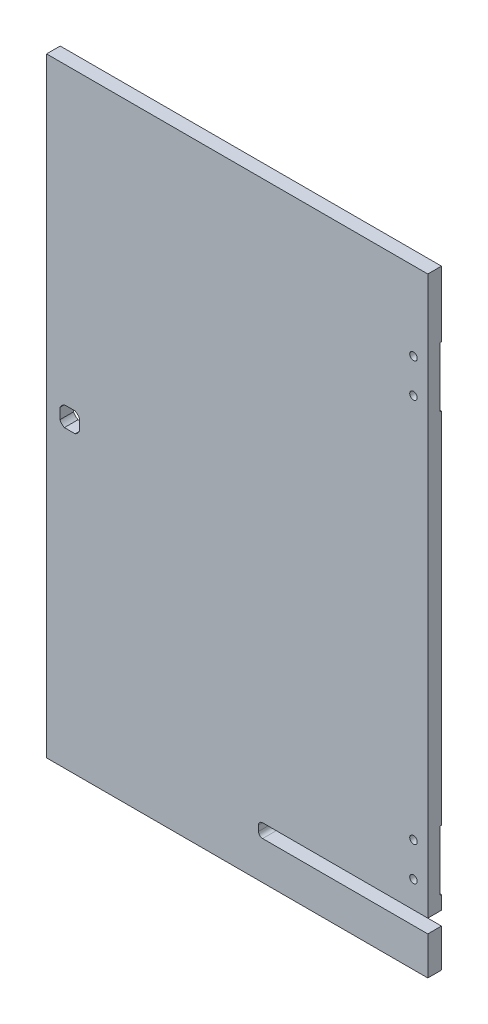
ISO-10303-21;
HEADER;
FILE_DESCRIPTION(('STEP AP214'),'2;1');
FILE_NAME('part.step','',(''),(''),'','','');
FILE_SCHEMA(('AUTOMOTIVE_DESIGN { 1 0 10303 214 1 1 1 1 }'));
ENDSEC;
DATA;
#1=APPLICATION_CONTEXT('core data for automotive mechanical design processes');
#2=APPLICATION_PROTOCOL_DEFINITION('international standard','automotive_design',2000,#1);
#3=PRODUCT_CONTEXT('',#1,'mechanical');
#4=PRODUCT('Part','Part','',(#3));
#5=PRODUCT_RELATED_PRODUCT_CATEGORY('part','',(#4));
#6=PRODUCT_DEFINITION_FORMATION('','',#4);
#7=PRODUCT_DEFINITION_CONTEXT('part definition',#1,'design');
#8=PRODUCT_DEFINITION('design','',#6,#7);
#9=PRODUCT_DEFINITION_SHAPE('','',#8);
#10=(LENGTH_UNIT() NAMED_UNIT(*) SI_UNIT(.MILLI.,.METRE.));
#11=(NAMED_UNIT(*) PLANE_ANGLE_UNIT() SI_UNIT($,.RADIAN.));
#12=(NAMED_UNIT(*) SI_UNIT($,.STERADIAN.) SOLID_ANGLE_UNIT());
#13=UNCERTAINTY_MEASURE_WITH_UNIT(LENGTH_MEASURE(1.E-05),#10,'distance_accuracy_value','');
#14=(GEOMETRIC_REPRESENTATION_CONTEXT(3) GLOBAL_UNCERTAINTY_ASSIGNED_CONTEXT((#13)) GLOBAL_UNIT_ASSIGNED_CONTEXT((#10,
#11,#12)) REPRESENTATION_CONTEXT('',''));
#15=CARTESIAN_POINT('',(0.,0.,0.));
#16=DIRECTION('',(0.,0.,1.));
#17=DIRECTION('',(1.,0.,0.));
#18=AXIS2_PLACEMENT_3D('',#15,#16,#17);
#19=CARTESIAN_POINT('',(0.,0.,10.));
#20=DIRECTION('',(0.,0.,1.));
#21=DIRECTION('',(1.,0.,0.));
#22=AXIS2_PLACEMENT_3D('',#19,#20,#21);
#23=PLANE('',#22);
#24=DIRECTION('',(1.,0.,0.));
#25=VECTOR('',#24,1.);
#26=CARTESIAN_POINT('',(140.749999999999,-185.5,10.));
#27=LINE('',#26,#25);
#28=CARTESIAN_POINT('',(18.6472087545796,-185.5,10.));
#29=VERTEX_POINT('',#28);
#30=CARTESIAN_POINT('',(139.75,-185.5,10.));
#31=VERTEX_POINT('',#30);
#32=EDGE_CURVE('E299',#29,#31,#27,.T.);
#33=ORIENTED_EDGE('',*,*,#32,.T.);
#34=DIRECTION('',(0.,1.,0.));
#35=VECTOR('',#34,1.);
#36=CARTESIAN_POINT('',(139.75,223.5,10.));
#37=LINE('',#36,#35);
#38=CARTESIAN_POINT('',(139.75,223.5,10.));
#39=VERTEX_POINT('',#38);
#40=EDGE_CURVE('E446',#31,#39,#37,.T.);
#41=ORIENTED_EDGE('',*,*,#40,.T.);
#42=DIRECTION('',(-1.,0.,0.));
#43=VECTOR('',#42,1.);
#44=CARTESIAN_POINT('',(-139.75,223.5,10.));
#45=LINE('',#44,#43);
#46=CARTESIAN_POINT('',(-139.75,223.5,10.));
#47=VERTEX_POINT('',#46);
#48=EDGE_CURVE('E445',#39,#47,#45,.T.);
#49=ORIENTED_EDGE('',*,*,#48,.T.);
#50=DIRECTION('',(0.,-1.,0.));
#51=VECTOR('',#50,1.);
#52=CARTESIAN_POINT('',(-139.75,223.5,10.));
#53=LINE('',#52,#51);
#54=CARTESIAN_POINT('',(-139.75,-223.5,10.));
#55=VERTEX_POINT('',#54);
#56=EDGE_CURVE('E448',#47,#55,#53,.T.);
#57=ORIENTED_EDGE('',*,*,#56,.T.);
#58=DIRECTION('',(1.,0.,0.));
#59=VECTOR('',#58,1.);
#60=CARTESIAN_POINT('',(-139.75,-223.5,10.));
#61=LINE('',#60,#59);
#62=CARTESIAN_POINT('',(139.75,-223.5,10.));
#63=VERTEX_POINT('',#62);
#64=EDGE_CURVE('E450',#55,#63,#61,.T.);
#65=ORIENTED_EDGE('',*,*,#64,.T.);
#66=CARTESIAN_POINT('',(139.75,-195.5,10.));
#67=VERTEX_POINT('',#66);
#68=EDGE_CURVE('E442',#63,#67,#37,.T.);
#69=ORIENTED_EDGE('',*,*,#68,.T.);
#70=DIRECTION('',(-1.,0.,0.));
#71=VECTOR('',#70,1.);
#72=CARTESIAN_POINT('',(140.749999999999,-195.5,10.));
#73=LINE('',#72,#71);
#74=CARTESIAN_POINT('',(18.6472087545796,-195.5,10.));
#75=VERTEX_POINT('',#74);
#76=EDGE_CURVE('E286',#67,#75,#73,.T.);
#77=ORIENTED_EDGE('',*,*,#76,.T.);
#78=CARTESIAN_POINT('',(18.6472087545795,-192.5,10.));
#79=DIRECTION('',(0.,0.,-1.));
#80=DIRECTION('',(-1.,0.,0.));
#81=AXIS2_PLACEMENT_3D('',#78,#79,#80);
#82=CIRCLE('',#81,3.);
#83=CARTESIAN_POINT('',(15.6472087545795,-192.5,10.));
#84=VERTEX_POINT('',#83);
#85=EDGE_CURVE('E289',#75,#84,#82,.T.);
#86=ORIENTED_EDGE('',*,*,#85,.T.);
#87=DIRECTION('',(0.,1.,0.));
#88=VECTOR('',#87,1.);
#89=CARTESIAN_POINT('',(15.6472087545795,-188.5,10.));
#90=LINE('',#89,#88);
#91=CARTESIAN_POINT('',(15.6472087545795,-188.5,10.));
#92=VERTEX_POINT('',#91);
#93=EDGE_CURVE('E293',#84,#92,#90,.T.);
#94=ORIENTED_EDGE('',*,*,#93,.T.);
#95=CARTESIAN_POINT('',(18.6472087545795,-188.5,10.));
#96=DIRECTION('',(0.,0.,-1.));
#97=DIRECTION('',(1.,0.,0.));
#98=AXIS2_PLACEMENT_3D('',#95,#96,#97);
#99=CIRCLE('',#98,3.);
#100=EDGE_CURVE('E296',#92,#29,#99,.T.);
#101=ORIENTED_EDGE('',*,*,#100,.T.);
#102=EDGE_LOOP('',(#33,#41,#49,#57,#65,#69,#77,#86,#94,#101));
#103=FACE_BOUND('',#102,.T.);
#104=CARTESIAN_POINT('',(129.249999999999,165.999999999999,10.));
#105=DIRECTION('',(0.,0.,-1.));
#106=DIRECTION('',(-1.,0.,0.));
#107=AXIS2_PLACEMENT_3D('',#104,#105,#106);
#108=CIRCLE('',#107,2.75000000000001);
#109=CARTESIAN_POINT('',(126.499999999999,165.999999999999,10.));
#110=VERTEX_POINT('',#109);
#111=EDGE_CURVE('E327',#110,#110,#108,.T.);
#112=ORIENTED_EDGE('',*,*,#111,.T.);
#113=EDGE_LOOP('',(#112));
#114=FACE_BOUND('',#113,.T.);
#115=CARTESIAN_POINT('',(129.249999999999,140.999999999999,10.));
#116=DIRECTION('',(0.,0.,-1.));
#117=DIRECTION('',(-1.,0.,0.));
#118=AXIS2_PLACEMENT_3D('',#115,#116,#117);
#119=CIRCLE('',#118,2.75000000000001);
#120=CARTESIAN_POINT('',(126.499999999999,140.999999999999,10.));
#121=VERTEX_POINT('',#120);
#122=EDGE_CURVE('E334',#121,#121,#119,.T.);
#123=ORIENTED_EDGE('',*,*,#122,.T.);
#124=EDGE_LOOP('',(#123));
#125=FACE_BOUND('',#124,.T.);
#126=CARTESIAN_POINT('',(129.249999999999,-141.000000000001,10.));
#127=DIRECTION('',(0.,0.,-1.));
#128=DIRECTION('',(-1.,0.,0.));
#129=AXIS2_PLACEMENT_3D('',#126,#127,#128);
#130=CIRCLE('',#129,2.75000000000001);
#131=CARTESIAN_POINT('',(126.499999999999,-141.000000000001,10.));
#132=VERTEX_POINT('',#131);
#133=EDGE_CURVE('E340',#132,#132,#130,.T.);
#134=ORIENTED_EDGE('',*,*,#133,.T.);
#135=EDGE_LOOP('',(#134));
#136=FACE_BOUND('',#135,.T.);
#137=CARTESIAN_POINT('',(129.249999999999,-166.000000000001,10.));
#138=DIRECTION('',(0.,0.,-1.));
#139=DIRECTION('',(-1.,0.,0.));
#140=AXIS2_PLACEMENT_3D('',#137,#138,#139);
#141=CIRCLE('',#140,2.75000000000001);
#142=CARTESIAN_POINT('',(126.499999999999,-166.000000000001,10.));
#143=VERTEX_POINT('',#142);
#144=EDGE_CURVE('E346',#143,#143,#141,.T.);
#145=ORIENTED_EDGE('',*,*,#144,.T.);
#146=EDGE_LOOP('',(#145));
#147=FACE_BOUND('',#146,.T.);
#148=CARTESIAN_POINT('',(-122.750000000001,0.,10.));
#149=DIRECTION('',(0.,0.,1.));
#150=DIRECTION('',(1.,0.,0.));
#151=AXIS2_PLACEMENT_3D('',#148,#149,#150);
#152=CIRCLE('',#151,8.25);
#153=CARTESIAN_POINT('',(-115.500000000001,3.93700393700592,10.));
#154=VERTEX_POINT('',#153);
#155=CARTESIAN_POINT('',(-118.812996062995,7.25000000000004,10.));
#156=VERTEX_POINT('',#155);
#157=EDGE_CURVE('E253',#154,#156,#152,.T.);
#158=ORIENTED_EDGE('',*,*,#157,.F.);
#159=DIRECTION('',(0.,-1.,0.));
#160=VECTOR('',#159,1.);
#161=CARTESIAN_POINT('',(-115.500000000001,0.,10.));
#162=LINE('',#161,#160);
#163=CARTESIAN_POINT('',(-115.500000000001,-3.93700393700586,10.));
#164=VERTEX_POINT('',#163);
#165=EDGE_CURVE('E47',#154,#164,#162,.T.);
#166=ORIENTED_EDGE('',*,*,#165,.T.);
#167=CARTESIAN_POINT('',(-118.812996062995,-7.24999999999996,10.));
#168=VERTEX_POINT('',#167);
#169=EDGE_CURVE('E247',#168,#164,#152,.T.);
#170=ORIENTED_EDGE('',*,*,#169,.F.);
#171=DIRECTION('',(1.,0.,0.));
#172=VECTOR('',#171,1.);
#173=CARTESIAN_POINT('',(0.,-7.24999999999996,10.));
#174=LINE('',#173,#172);
#175=CARTESIAN_POINT('',(-126.687003937007,-7.24999999999996,10.));
#176=VERTEX_POINT('',#175);
#177=EDGE_CURVE('E250',#176,#168,#174,.T.);
#178=ORIENTED_EDGE('',*,*,#177,.F.);
#179=CARTESIAN_POINT('',(-130.000000000001,-3.93700393700588,10.));
#180=VERTEX_POINT('',#179);
#181=EDGE_CURVE('E252',#180,#176,#152,.T.);
#182=ORIENTED_EDGE('',*,*,#181,.F.);
#183=DIRECTION('',(0.,-1.,0.));
#184=VECTOR('',#183,1.);
#185=CARTESIAN_POINT('',(-130.000000000001,0.,10.));
#186=LINE('',#185,#184);
#187=CARTESIAN_POINT('',(-130.000000000001,3.93700393700594,10.));
#188=VERTEX_POINT('',#187);
#189=EDGE_CURVE('E267',#188,#180,#186,.T.);
#190=ORIENTED_EDGE('',*,*,#189,.F.);
#191=CARTESIAN_POINT('',(-126.687003937007,7.25000000000004,10.));
#192=VERTEX_POINT('',#191);
#193=EDGE_CURVE('E264',#192,#188,#152,.T.);
#194=ORIENTED_EDGE('',*,*,#193,.F.);
#195=DIRECTION('',(1.,0.,0.));
#196=VECTOR('',#195,1.);
#197=CARTESIAN_POINT('',(0.,7.25000000000004,10.));
#198=LINE('',#197,#196);
#199=EDGE_CURVE('E263',#192,#156,#198,.T.);
#200=ORIENTED_EDGE('',*,*,#199,.T.);
#201=EDGE_LOOP('',(#158,#166,#170,#178,#182,#190,#194,#200));
#202=FACE_BOUND('',#201,.T.);
#203=ADVANCED_FACE('F32',(#103,#114,#125,#136,#147,#202),#23,.T.);
#204=CARTESIAN_POINT('',(0.,0.,0.));
#205=DIRECTION('',(0.,0.,1.));
#206=DIRECTION('',(1.,0.,0.));
#207=AXIS2_PLACEMENT_3D('',#204,#205,#206);
#208=PLANE('',#207);
#209=DIRECTION('',(0.,1.,0.));
#210=VECTOR('',#209,1.);
#211=CARTESIAN_POINT('',(139.75,223.5,0.));
#212=LINE('',#211,#210);
#213=CARTESIAN_POINT('',(139.75,-185.5,0.));
#214=VERTEX_POINT('',#213);
#215=CARTESIAN_POINT('',(139.75,-175.500000000001,0.));
#216=VERTEX_POINT('',#215);
#217=EDGE_CURVE('E457',#214,#216,#212,.T.);
#218=ORIENTED_EDGE('',*,*,#217,.F.);
#219=DIRECTION('',(1.,0.,0.));
#220=VECTOR('',#219,1.);
#221=CARTESIAN_POINT('',(140.749999999999,-185.5,0.));
#222=LINE('',#221,#220);
#223=CARTESIAN_POINT('',(18.6472087545796,-185.5,0.));
#224=VERTEX_POINT('',#223);
#225=EDGE_CURVE('E290',#224,#214,#222,.T.);
#226=ORIENTED_EDGE('',*,*,#225,.F.);
#227=CARTESIAN_POINT('',(18.6472087545795,-188.5,0.));
#228=DIRECTION('',(0.,0.,-1.));
#229=DIRECTION('',(1.,0.,0.));
#230=AXIS2_PLACEMENT_3D('',#227,#228,#229);
#231=CIRCLE('',#230,3.);
#232=CARTESIAN_POINT('',(15.6472087545795,-188.5,0.));
#233=VERTEX_POINT('',#232);
#234=EDGE_CURVE('E308',#233,#224,#231,.T.);
#235=ORIENTED_EDGE('',*,*,#234,.F.);
#236=DIRECTION('',(0.,1.,0.));
#237=VECTOR('',#236,1.);
#238=CARTESIAN_POINT('',(15.6472087545795,-188.5,0.));
#239=LINE('',#238,#237);
#240=CARTESIAN_POINT('',(15.6472087545795,-192.5,0.));
#241=VERTEX_POINT('',#240);
#242=EDGE_CURVE('E305',#241,#233,#239,.T.);
#243=ORIENTED_EDGE('',*,*,#242,.F.);
#244=CARTESIAN_POINT('',(18.6472087545795,-192.5,0.));
#245=DIRECTION('',(0.,0.,-1.));
#246=DIRECTION('',(-1.,0.,0.));
#247=AXIS2_PLACEMENT_3D('',#244,#245,#246);
#248=CIRCLE('',#247,3.);
#249=CARTESIAN_POINT('',(18.6472087545796,-195.5,0.));
#250=VERTEX_POINT('',#249);
#251=EDGE_CURVE('E274',#250,#241,#248,.T.);
#252=ORIENTED_EDGE('',*,*,#251,.F.);
#253=DIRECTION('',(1.,0.,0.));
#254=VECTOR('',#253,1.);
#255=CARTESIAN_POINT('',(0.,-195.5,0.));
#256=LINE('',#255,#254);
#257=CARTESIAN_POINT('',(139.75,-195.5,0.));
#258=VERTEX_POINT('',#257);
#259=EDGE_CURVE('E11',#250,#258,#256,.T.);
#260=ORIENTED_EDGE('',*,*,#259,.T.);
#261=CARTESIAN_POINT('',(139.75,-223.5,0.));
#262=VERTEX_POINT('',#261);
#263=EDGE_CURVE('E453',#262,#258,#212,.T.);
#264=ORIENTED_EDGE('',*,*,#263,.F.);
#265=DIRECTION('',(1.,0.,0.));
#266=VECTOR('',#265,1.);
#267=CARTESIAN_POINT('',(-139.75,-223.5,0.));
#268=LINE('',#267,#266);
#269=CARTESIAN_POINT('',(-139.75,-223.5,0.));
#270=VERTEX_POINT('',#269);
#271=EDGE_CURVE('E462',#270,#262,#268,.T.);
#272=ORIENTED_EDGE('',*,*,#271,.F.);
#273=DIRECTION('',(0.,-1.,0.));
#274=VECTOR('',#273,1.);
#275=CARTESIAN_POINT('',(-139.75,223.5,0.));
#276=LINE('',#275,#274);
#277=CARTESIAN_POINT('',(-139.75,223.5,0.));
#278=VERTEX_POINT('',#277);
#279=EDGE_CURVE('E460',#278,#270,#276,.T.);
#280=ORIENTED_EDGE('',*,*,#279,.F.);
#281=DIRECTION('',(-1.,0.,0.));
#282=VECTOR('',#281,1.);
#283=CARTESIAN_POINT('',(-139.75,223.5,0.));
#284=LINE('',#283,#282);
#285=CARTESIAN_POINT('',(139.75,223.5,0.));
#286=VERTEX_POINT('',#285);
#287=EDGE_CURVE('E456',#286,#278,#284,.T.);
#288=ORIENTED_EDGE('',*,*,#287,.F.);
#289=CARTESIAN_POINT('',(139.75,175.499999999999,0.));
#290=VERTEX_POINT('',#289);
#291=EDGE_CURVE('E388',#290,#286,#212,.T.);
#292=ORIENTED_EDGE('',*,*,#291,.F.);
#293=DIRECTION('',(1.,0.,0.));
#294=VECTOR('',#293,1.);
#295=CARTESIAN_POINT('',(139.75,175.499999999999,0.));
#296=LINE('',#295,#294);
#297=CARTESIAN_POINT('',(121.749999999999,175.499999999999,0.));
#298=VERTEX_POINT('',#297);
#299=EDGE_CURVE('E355',#298,#290,#296,.T.);
#300=ORIENTED_EDGE('',*,*,#299,.F.);
#301=CARTESIAN_POINT('',(121.749999999999,172.499999999999,0.));
#302=DIRECTION('',(0.,0.,-1.));
#303=DIRECTION('',(1.,0.,0.));
#304=AXIS2_PLACEMENT_3D('',#301,#302,#303);
#305=CIRCLE('',#304,3.);
#306=CARTESIAN_POINT('',(118.749999999999,172.499999999999,0.));
#307=VERTEX_POINT('',#306);
#308=EDGE_CURVE('E381',#307,#298,#305,.T.);
#309=ORIENTED_EDGE('',*,*,#308,.F.);
#310=DIRECTION('',(0.,1.,0.));
#311=VECTOR('',#310,1.);
#312=CARTESIAN_POINT('',(118.749999999999,172.499999999999,0.));
#313=LINE('',#312,#311);
#314=CARTESIAN_POINT('',(118.749999999999,134.499999999999,0.));
#315=VERTEX_POINT('',#314);
#316=EDGE_CURVE('E378',#315,#307,#313,.T.);
#317=ORIENTED_EDGE('',*,*,#316,.F.);
#318=CARTESIAN_POINT('',(121.749999999999,134.499999999999,0.));
#319=DIRECTION('',(0.,0.,-1.));
#320=DIRECTION('',(-1.,0.,0.));
#321=AXIS2_PLACEMENT_3D('',#318,#319,#320);
#322=CIRCLE('',#321,3.);
#323=CARTESIAN_POINT('',(121.749999999999,131.499999999999,0.));
#324=VERTEX_POINT('',#323);
#325=EDGE_CURVE('E374',#324,#315,#322,.T.);
#326=ORIENTED_EDGE('',*,*,#325,.F.);
#327=DIRECTION('',(-1.,0.,0.));
#328=VECTOR('',#327,1.);
#329=CARTESIAN_POINT('',(139.75,131.499999999999,0.));
#330=LINE('',#329,#328);
#331=CARTESIAN_POINT('',(139.75,131.499999999999,0.));
#332=VERTEX_POINT('',#331);
#333=EDGE_CURVE('E371',#332,#324,#330,.T.);
#334=ORIENTED_EDGE('',*,*,#333,.F.);
#335=CARTESIAN_POINT('',(139.75,-131.500000000001,0.));
#336=VERTEX_POINT('',#335);
#337=EDGE_CURVE('E458',#336,#332,#212,.T.);
#338=ORIENTED_EDGE('',*,*,#337,.F.);
#339=DIRECTION('',(1.,0.,0.));
#340=VECTOR('',#339,1.);
#341=CARTESIAN_POINT('',(139.75,-131.500000000001,0.));
#342=LINE('',#341,#340);
#343=CARTESIAN_POINT('',(121.749999999999,-131.500000000001,0.));
#344=VERTEX_POINT('',#343);
#345=EDGE_CURVE('E402',#344,#336,#342,.T.);
#346=ORIENTED_EDGE('',*,*,#345,.F.);
#347=CARTESIAN_POINT('',(121.749999999999,-134.500000000001,0.));
#348=DIRECTION('',(0.,0.,-1.));
#349=DIRECTION('',(1.,0.,0.));
#350=AXIS2_PLACEMENT_3D('',#347,#348,#349);
#351=CIRCLE('',#350,3.);
#352=CARTESIAN_POINT('',(118.749999999999,-134.500000000001,0.));
#353=VERTEX_POINT('',#352);
#354=EDGE_CURVE('E426',#353,#344,#351,.T.);
#355=ORIENTED_EDGE('',*,*,#354,.F.);
#356=DIRECTION('',(0.,1.,0.));
#357=VECTOR('',#356,1.);
#358=CARTESIAN_POINT('',(118.749999999999,-134.500000000001,0.));
#359=LINE('',#358,#357);
#360=CARTESIAN_POINT('',(118.749999999999,-172.500000000001,0.));
#361=VERTEX_POINT('',#360);
#362=EDGE_CURVE('E423',#361,#353,#359,.T.);
#363=ORIENTED_EDGE('',*,*,#362,.F.);
#364=CARTESIAN_POINT('',(121.749999999999,-172.500000000001,0.));
#365=DIRECTION('',(0.,0.,-1.));
#366=DIRECTION('',(-1.,0.,0.));
#367=AXIS2_PLACEMENT_3D('',#364,#365,#366);
#368=CIRCLE('',#367,3.);
#369=CARTESIAN_POINT('',(121.749999999999,-175.500000000001,0.));
#370=VERTEX_POINT('',#369);
#371=EDGE_CURVE('E420',#370,#361,#368,.T.);
#372=ORIENTED_EDGE('',*,*,#371,.F.);
#373=DIRECTION('',(-1.,0.,0.));
#374=VECTOR('',#373,1.);
#375=CARTESIAN_POINT('',(139.75,-175.500000000001,0.));
#376=LINE('',#375,#374);
#377=EDGE_CURVE('E330',#216,#370,#376,.T.);
#378=ORIENTED_EDGE('',*,*,#377,.F.);
#379=EDGE_LOOP('',(#218,#226,#235,#243,#252,#260,#264,#272,#280,#288,#292,#300,#309,#317,#326,
#334,#338,#346,#355,#363,#372,#378));
#380=FACE_BOUND('',#379,.T.);
#381=DIRECTION('',(0.,-1.,0.));
#382=VECTOR('',#381,1.);
#383=CARTESIAN_POINT('',(-115.500000000001,0.,0.));
#384=LINE('',#383,#382);
#385=CARTESIAN_POINT('',(-115.500000000001,3.93700393700592,0.));
#386=VERTEX_POINT('',#385);
#387=CARTESIAN_POINT('',(-115.500000000001,-3.93700393700586,0.));
#388=VERTEX_POINT('',#387);
#389=EDGE_CURVE('E230',#386,#388,#384,.T.);
#390=ORIENTED_EDGE('',*,*,#389,.F.);
#391=CARTESIAN_POINT('',(-122.750000000001,0.,0.));
#392=DIRECTION('',(0.,0.,1.));
#393=DIRECTION('',(1.,0.,0.));
#394=AXIS2_PLACEMENT_3D('',#391,#392,#393);
#395=CIRCLE('',#394,8.25);
#396=CARTESIAN_POINT('',(-118.812996062995,7.25000000000003,0.));
#397=VERTEX_POINT('',#396);
#398=EDGE_CURVE('E236',#386,#397,#395,.T.);
#399=ORIENTED_EDGE('',*,*,#398,.T.);
#400=DIRECTION('',(1.,0.,0.));
#401=VECTOR('',#400,1.);
#402=CARTESIAN_POINT('',(0.,7.25000000000004,0.));
#403=LINE('',#402,#401);
#404=CARTESIAN_POINT('',(-126.687003937007,7.25000000000004,0.));
#405=VERTEX_POINT('',#404);
#406=EDGE_CURVE('E240',#405,#397,#403,.T.);
#407=ORIENTED_EDGE('',*,*,#406,.F.);
#408=CARTESIAN_POINT('',(-130.000000000001,3.93700393700594,0.));
#409=VERTEX_POINT('',#408);
#410=EDGE_CURVE('E242',#405,#409,#395,.T.);
#411=ORIENTED_EDGE('',*,*,#410,.T.);
#412=DIRECTION('',(0.,-1.,0.));
#413=VECTOR('',#412,1.);
#414=CARTESIAN_POINT('',(-130.000000000001,0.,0.));
#415=LINE('',#414,#413);
#416=CARTESIAN_POINT('',(-130.000000000001,-3.93700393700588,0.));
#417=VERTEX_POINT('',#416);
#418=EDGE_CURVE('E256',#409,#417,#415,.T.);
#419=ORIENTED_EDGE('',*,*,#418,.T.);
#420=CARTESIAN_POINT('',(-126.687003937007,-7.24999999999996,0.));
#421=VERTEX_POINT('',#420);
#422=EDGE_CURVE('E259',#417,#421,#395,.T.);
#423=ORIENTED_EDGE('',*,*,#422,.T.);
#424=DIRECTION('',(1.,0.,0.));
#425=VECTOR('',#424,1.);
#426=CARTESIAN_POINT('',(0.,-7.24999999999996,0.));
#427=LINE('',#426,#425);
#428=CARTESIAN_POINT('',(-118.812996062995,-7.24999999999996,0.));
#429=VERTEX_POINT('',#428);
#430=EDGE_CURVE('E260',#421,#429,#427,.T.);
#431=ORIENTED_EDGE('',*,*,#430,.T.);
#432=EDGE_CURVE('E233',#429,#388,#395,.T.);
#433=ORIENTED_EDGE('',*,*,#432,.T.);
#434=EDGE_LOOP('',(#390,#399,#407,#411,#419,#423,#431,#433));
#435=FACE_BOUND('',#434,.T.);
#436=ADVANCED_FACE('F244',(#380,#435),#208,.F.);
#437=CARTESIAN_POINT('',(139.75,223.5,10.));
#438=DIRECTION('',(-1.,0.,0.));
#439=DIRECTION('',(0.,-1.,0.));
#440=AXIS2_PLACEMENT_3D('',#437,#438,#439);
#441=PLANE('',#440);
#442=ORIENTED_EDGE('',*,*,#40,.F.);
#443=DIRECTION('',(0.,0.,-1.));
#444=VECTOR('',#443,1.);
#445=CARTESIAN_POINT('',(139.75,-185.5,10.));
#446=LINE('',#445,#444);
#447=EDGE_CURVE('E323',#31,#214,#446,.T.);
#448=ORIENTED_EDGE('',*,*,#447,.T.);
#449=ORIENTED_EDGE('',*,*,#217,.T.);
#450=DIRECTION('',(0.,0.,-1.));
#451=VECTOR('',#450,1.);
#452=CARTESIAN_POINT('',(139.75,-175.500000000001,1.));
#453=LINE('',#452,#451);
#454=CARTESIAN_POINT('',(139.75,-175.500000000001,1.));
#455=VERTEX_POINT('',#454);
#456=EDGE_CURVE('E417',#455,#216,#453,.T.);
#457=ORIENTED_EDGE('',*,*,#456,.F.);
#458=DIRECTION('',(0.,-1.,0.));
#459=VECTOR('',#458,1.);
#460=CARTESIAN_POINT('',(139.75,-131.500000000001,1.));
#461=LINE('',#460,#459);
#462=CARTESIAN_POINT('',(139.75,-131.500000000001,1.));
#463=VERTEX_POINT('',#462);
#464=EDGE_CURVE('E398',#463,#455,#461,.T.);
#465=ORIENTED_EDGE('',*,*,#464,.F.);
#466=DIRECTION('',(0.,0.,-1.));
#467=VECTOR('',#466,1.);
#468=CARTESIAN_POINT('',(139.75,-131.500000000001,1.));
#469=LINE('',#468,#467);
#470=EDGE_CURVE('E375',#463,#336,#469,.T.);
#471=ORIENTED_EDGE('',*,*,#470,.T.);
#472=ORIENTED_EDGE('',*,*,#337,.T.);
#473=DIRECTION('',(0.,0.,-1.));
#474=VECTOR('',#473,1.);
#475=CARTESIAN_POINT('',(139.75,131.499999999999,1.));
#476=LINE('',#475,#474);
#477=CARTESIAN_POINT('',(139.75,131.499999999999,1.));
#478=VERTEX_POINT('',#477);
#479=EDGE_CURVE('E370',#478,#332,#476,.T.);
#480=ORIENTED_EDGE('',*,*,#479,.F.);
#481=DIRECTION('',(0.,-1.,0.));
#482=VECTOR('',#481,1.);
#483=CARTESIAN_POINT('',(139.75,175.499999999999,1.));
#484=LINE('',#483,#482);
#485=CARTESIAN_POINT('',(139.75,175.499999999999,1.));
#486=VERTEX_POINT('',#485);
#487=EDGE_CURVE('E351',#486,#478,#484,.T.);
#488=ORIENTED_EDGE('',*,*,#487,.F.);
#489=DIRECTION('',(0.,0.,-1.));
#490=VECTOR('',#489,1.);
#491=CARTESIAN_POINT('',(139.75,175.499999999999,1.));
#492=LINE('',#491,#490);
#493=EDGE_CURVE('E385',#486,#290,#492,.T.);
#494=ORIENTED_EDGE('',*,*,#493,.T.);
#495=ORIENTED_EDGE('',*,*,#291,.T.);
#496=DIRECTION('',(0.,0.,-1.));
#497=VECTOR('',#496,1.);
#498=CARTESIAN_POINT('',(139.75,223.5,10.));
#499=LINE('',#498,#497);
#500=EDGE_CURVE('E40',#39,#286,#499,.T.);
#501=ORIENTED_EDGE('',*,*,#500,.F.);
#502=EDGE_LOOP('',(#442,#448,#449,#457,#465,#471,#472,#480,#488,#494,#495,#501));
#503=FACE_BOUND('',#502,.T.);
#504=ADVANCED_FACE('F480',(#503),#441,.F.);
#505=ORIENTED_EDGE('',*,*,#263,.T.);
#506=DIRECTION('',(0.,0.,1.));
#507=VECTOR('',#506,1.);
#508=CARTESIAN_POINT('',(139.75,-195.5,10.));
#509=LINE('',#508,#507);
#510=EDGE_CURVE('E314',#258,#67,#509,.T.);
#511=ORIENTED_EDGE('',*,*,#510,.T.);
#512=ORIENTED_EDGE('',*,*,#68,.F.);
#513=DIRECTION('',(0.,0.,-1.));
#514=VECTOR('',#513,1.);
#515=CARTESIAN_POINT('',(139.75,-223.5,10.));
#516=LINE('',#515,#514);
#517=EDGE_CURVE('E452',#63,#262,#516,.T.);
#518=ORIENTED_EDGE('',*,*,#517,.T.);
#519=EDGE_LOOP('',(#505,#511,#512,#518));
#520=FACE_BOUND('',#519,.T.);
#521=ADVANCED_FACE('F34',(#520),#441,.F.);
#522=CARTESIAN_POINT('',(-139.75,223.5,10.));
#523=DIRECTION('',(0.,-1.,0.));
#524=DIRECTION('',(0.,0.,-1.));
#525=AXIS2_PLACEMENT_3D('',#522,#523,#524);
#526=PLANE('',#525);
#527=ORIENTED_EDGE('',*,*,#287,.T.);
#528=DIRECTION('',(0.,0.,-1.));
#529=VECTOR('',#528,1.);
#530=CARTESIAN_POINT('',(-139.75,223.5,10.));
#531=LINE('',#530,#529);
#532=EDGE_CURVE('E469',#47,#278,#531,.T.);
#533=ORIENTED_EDGE('',*,*,#532,.F.);
#534=ORIENTED_EDGE('',*,*,#48,.F.);
#535=ORIENTED_EDGE('',*,*,#500,.T.);
#536=EDGE_LOOP('',(#527,#533,#534,#535));
#537=FACE_BOUND('',#536,.T.);
#538=ADVANCED_FACE('F475',(#537),#526,.F.);
#539=CARTESIAN_POINT('',(-139.75,223.5,10.));
#540=DIRECTION('',(1.,0.,0.));
#541=DIRECTION('',(0.,1.,0.));
#542=AXIS2_PLACEMENT_3D('',#539,#540,#541);
#543=PLANE('',#542);
#544=ORIENTED_EDGE('',*,*,#279,.T.);
#545=DIRECTION('',(0.,0.,-1.));
#546=VECTOR('',#545,1.);
#547=CARTESIAN_POINT('',(-139.75,-223.5,10.));
#548=LINE('',#547,#546);
#549=EDGE_CURVE('E466',#55,#270,#548,.T.);
#550=ORIENTED_EDGE('',*,*,#549,.F.);
#551=ORIENTED_EDGE('',*,*,#56,.F.);
#552=ORIENTED_EDGE('',*,*,#532,.T.);
#553=EDGE_LOOP('',(#544,#550,#551,#552));
#554=FACE_BOUND('',#553,.T.);
#555=ADVANCED_FACE('F491',(#554),#543,.F.);
#556=CARTESIAN_POINT('',(-139.75,-223.5,10.));
#557=DIRECTION('',(0.,1.,0.));
#558=DIRECTION('',(0.,0.,1.));
#559=AXIS2_PLACEMENT_3D('',#556,#557,#558);
#560=PLANE('',#559);
#561=ORIENTED_EDGE('',*,*,#271,.T.);
#562=ORIENTED_EDGE('',*,*,#517,.F.);
#563=ORIENTED_EDGE('',*,*,#64,.F.);
#564=ORIENTED_EDGE('',*,*,#549,.T.);
#565=EDGE_LOOP('',(#561,#562,#563,#564));
#566=FACE_BOUND('',#565,.T.);
#567=ADVANCED_FACE('F495',(#566),#560,.F.);
#568=CARTESIAN_POINT('',(139.75,-131.500000000001,1.));
#569=DIRECTION('',(0.,1.,0.));
#570=DIRECTION('',(0.,0.,1.));
#571=AXIS2_PLACEMENT_3D('',#568,#569,#570);
#572=PLANE('',#571);
#573=ORIENTED_EDGE('',*,*,#345,.T.);
#574=ORIENTED_EDGE('',*,*,#470,.F.);
#575=DIRECTION('',(1.,0.,0.));
#576=VECTOR('',#575,1.);
#577=CARTESIAN_POINT('',(139.75,-131.500000000001,1.));
#578=LINE('',#577,#576);
#579=CARTESIAN_POINT('',(121.749999999999,-131.500000000001,1.));
#580=VERTEX_POINT('',#579);
#581=EDGE_CURVE('E414',#580,#463,#578,.T.);
#582=ORIENTED_EDGE('',*,*,#581,.F.);
#583=DIRECTION('',(0.,0.,-1.));
#584=VECTOR('',#583,1.);
#585=CARTESIAN_POINT('',(121.749999999999,-131.500000000001,1.));
#586=LINE('',#585,#584);
#587=EDGE_CURVE('E432',#580,#344,#586,.T.);
#588=ORIENTED_EDGE('',*,*,#587,.T.);
#589=EDGE_LOOP('',(#573,#574,#582,#588));
#590=FACE_BOUND('',#589,.T.);
#591=ADVANCED_FACE('F555',(#590),#572,.F.);
#592=CARTESIAN_POINT('',(121.749999999999,-134.500000000001,1.));
#593=DIRECTION('',(0.,0.,-1.));
#594=DIRECTION('',(-1.,0.,0.));
#595=AXIS2_PLACEMENT_3D('',#592,#593,#594);
#596=CYLINDRICAL_SURFACE('',#595,3.);
#597=ORIENTED_EDGE('',*,*,#354,.T.);
#598=ORIENTED_EDGE('',*,*,#587,.F.);
#599=CARTESIAN_POINT('',(121.749999999999,-134.500000000001,1.));
#600=DIRECTION('',(0.,0.,-1.));
#601=DIRECTION('',(1.,0.,0.));
#602=AXIS2_PLACEMENT_3D('',#599,#600,#601);
#603=CIRCLE('',#602,3.);
#604=CARTESIAN_POINT('',(118.749999999999,-134.500000000001,1.));
#605=VERTEX_POINT('',#604);
#606=EDGE_CURVE('E411',#605,#580,#603,.T.);
#607=ORIENTED_EDGE('',*,*,#606,.F.);
#608=DIRECTION('',(0.,0.,-1.));
#609=VECTOR('',#608,1.);
#610=CARTESIAN_POINT('',(118.749999999999,-134.500000000001,1.));
#611=LINE('',#610,#609);
#612=EDGE_CURVE('E434',#605,#353,#611,.T.);
#613=ORIENTED_EDGE('',*,*,#612,.T.);
#614=EDGE_LOOP('',(#597,#598,#607,#613));
#615=FACE_BOUND('',#614,.T.);
#616=ADVANCED_FACE('F833',(#615),#596,.F.);
#617=CARTESIAN_POINT('',(118.749999999999,-134.500000000001,1.));
#618=DIRECTION('',(-1.,0.,0.));
#619=DIRECTION('',(0.,0.,1.));
#620=AXIS2_PLACEMENT_3D('',#617,#618,#619);
#621=PLANE('',#620);
#622=ORIENTED_EDGE('',*,*,#362,.T.);
#623=ORIENTED_EDGE('',*,*,#612,.F.);
#624=DIRECTION('',(0.,1.,0.));
#625=VECTOR('',#624,1.);
#626=CARTESIAN_POINT('',(118.749999999999,-134.500000000001,1.));
#627=LINE('',#626,#625);
#628=CARTESIAN_POINT('',(118.749999999999,-172.500000000001,1.));
#629=VERTEX_POINT('',#628);
#630=EDGE_CURVE('E408',#629,#605,#627,.T.);
#631=ORIENTED_EDGE('',*,*,#630,.F.);
#632=DIRECTION('',(0.,0.,-1.));
#633=VECTOR('',#632,1.);
#634=CARTESIAN_POINT('',(118.749999999999,-172.500000000001,1.));
#635=LINE('',#634,#633);
#636=EDGE_CURVE('E436',#629,#361,#635,.T.);
#637=ORIENTED_EDGE('',*,*,#636,.T.);
#638=EDGE_LOOP('',(#622,#623,#631,#637));
#639=FACE_BOUND('',#638,.T.);
#640=ADVANCED_FACE('F842',(#639),#621,.F.);
#641=CARTESIAN_POINT('',(121.749999999999,-172.500000000001,1.));
#642=DIRECTION('',(0.,0.,-1.));
#643=DIRECTION('',(-1.,0.,0.));
#644=AXIS2_PLACEMENT_3D('',#641,#642,#643);
#645=CYLINDRICAL_SURFACE('',#644,3.);
#646=ORIENTED_EDGE('',*,*,#371,.T.);
#647=ORIENTED_EDGE('',*,*,#636,.F.);
#648=CARTESIAN_POINT('',(121.749999999999,-172.500000000001,1.));
#649=DIRECTION('',(0.,0.,-1.));
#650=DIRECTION('',(-1.,0.,0.));
#651=AXIS2_PLACEMENT_3D('',#648,#649,#650);
#652=CIRCLE('',#651,3.);
#653=CARTESIAN_POINT('',(121.749999999999,-175.500000000001,1.));
#654=VERTEX_POINT('',#653);
#655=EDGE_CURVE('E405',#654,#629,#652,.T.);
#656=ORIENTED_EDGE('',*,*,#655,.F.);
#657=DIRECTION('',(0.,0.,-1.));
#658=VECTOR('',#657,1.);
#659=CARTESIAN_POINT('',(121.749999999999,-175.500000000001,1.));
#660=LINE('',#659,#658);
#661=EDGE_CURVE('E438',#654,#370,#660,.T.);
#662=ORIENTED_EDGE('',*,*,#661,.T.);
#663=EDGE_LOOP('',(#646,#647,#656,#662));
#664=FACE_BOUND('',#663,.T.);
#665=ADVANCED_FACE('F851',(#664),#645,.F.);
#666=CARTESIAN_POINT('',(139.75,-175.500000000001,1.));
#667=DIRECTION('',(0.,-1.,0.));
#668=DIRECTION('',(0.,0.,-1.));
#669=AXIS2_PLACEMENT_3D('',#666,#667,#668);
#670=PLANE('',#669);
#671=ORIENTED_EDGE('',*,*,#377,.T.);
#672=ORIENTED_EDGE('',*,*,#661,.F.);
#673=DIRECTION('',(-1.,0.,0.));
#674=VECTOR('',#673,1.);
#675=CARTESIAN_POINT('',(139.75,-175.500000000001,1.));
#676=LINE('',#675,#674);
#677=EDGE_CURVE('E401',#455,#654,#676,.T.);
#678=ORIENTED_EDGE('',*,*,#677,.F.);
#679=ORIENTED_EDGE('',*,*,#456,.T.);
#680=EDGE_LOOP('',(#671,#672,#678,#679));
#681=FACE_BOUND('',#680,.T.);
#682=ADVANCED_FACE('F550',(#681),#670,.F.);
#683=CARTESIAN_POINT('',(121.749999999999,-172.500000000001,1.));
#684=DIRECTION('',(0.,0.,-1.));
#685=DIRECTION('',(-1.,0.,0.));
#686=AXIS2_PLACEMENT_3D('',#683,#684,#685);
#687=PLANE('',#686);
#688=CARTESIAN_POINT('',(129.249999999999,-141.000000000001,1.));
#689=DIRECTION('',(0.,0.,-1.));
#690=DIRECTION('',(-1.,0.,0.));
#691=AXIS2_PLACEMENT_3D('',#688,#689,#690);
#692=CIRCLE('',#691,2.75000000000001);
#693=CARTESIAN_POINT('',(126.499999999999,-141.000000000001,1.));
#694=VERTEX_POINT('',#693);
#695=EDGE_CURVE('E343',#694,#694,#692,.T.);
#696=ORIENTED_EDGE('',*,*,#695,.F.);
#697=EDGE_LOOP('',(#696));
#698=FACE_BOUND('',#697,.T.);
#699=CARTESIAN_POINT('',(129.249999999999,-166.000000000001,1.));
#700=DIRECTION('',(0.,0.,-1.));
#701=DIRECTION('',(-1.,0.,0.));
#702=AXIS2_PLACEMENT_3D('',#699,#700,#701);
#703=CIRCLE('',#702,2.75000000000001);
#704=CARTESIAN_POINT('',(126.499999999999,-166.000000000001,1.));
#705=VERTEX_POINT('',#704);
#706=EDGE_CURVE('E326',#705,#705,#703,.T.);
#707=ORIENTED_EDGE('',*,*,#706,.F.);
#708=EDGE_LOOP('',(#707));
#709=FACE_BOUND('',#708,.T.);
#710=ORIENTED_EDGE('',*,*,#464,.T.);
#711=ORIENTED_EDGE('',*,*,#677,.T.);
#712=ORIENTED_EDGE('',*,*,#655,.T.);
#713=ORIENTED_EDGE('',*,*,#630,.T.);
#714=ORIENTED_EDGE('',*,*,#606,.T.);
#715=ORIENTED_EDGE('',*,*,#581,.T.);
#716=EDGE_LOOP('',(#710,#711,#712,#713,#714,#715));
#717=FACE_BOUND('',#716,.T.);
#718=ADVANCED_FACE('F611',(#698,#709,#717),#687,.T.);
#719=CARTESIAN_POINT('',(139.75,175.499999999999,1.));
#720=DIRECTION('',(0.,1.,0.));
#721=DIRECTION('',(-1.,0.,0.));
#722=AXIS2_PLACEMENT_3D('',#719,#720,#721);
#723=PLANE('',#722);
#724=ORIENTED_EDGE('',*,*,#299,.T.);
#725=ORIENTED_EDGE('',*,*,#493,.F.);
#726=DIRECTION('',(1.,0.,0.));
#727=VECTOR('',#726,1.);
#728=CARTESIAN_POINT('',(139.75,175.499999999999,1.));
#729=LINE('',#728,#727);
#730=CARTESIAN_POINT('',(121.749999999999,175.499999999999,1.));
#731=VERTEX_POINT('',#730);
#732=EDGE_CURVE('E367',#731,#486,#729,.T.);
#733=ORIENTED_EDGE('',*,*,#732,.F.);
#734=DIRECTION('',(0.,0.,-1.));
#735=VECTOR('',#734,1.);
#736=CARTESIAN_POINT('',(121.749999999999,175.499999999999,1.));
#737=LINE('',#736,#735);
#738=EDGE_CURVE('E389',#731,#298,#737,.T.);
#739=ORIENTED_EDGE('',*,*,#738,.T.);
#740=EDGE_LOOP('',(#724,#725,#733,#739));
#741=FACE_BOUND('',#740,.T.);
#742=ADVANCED_FACE('F526',(#741),#723,.F.);
#743=CARTESIAN_POINT('',(121.749999999999,172.499999999999,1.));
#744=DIRECTION('',(0.,0.,-1.));
#745=DIRECTION('',(-1.,0.,0.));
#746=AXIS2_PLACEMENT_3D('',#743,#744,#745);
#747=CYLINDRICAL_SURFACE('',#746,3.);
#748=ORIENTED_EDGE('',*,*,#308,.T.);
#749=ORIENTED_EDGE('',*,*,#738,.F.);
#750=CARTESIAN_POINT('',(121.749999999999,172.499999999999,1.));
#751=DIRECTION('',(0.,0.,-1.));
#752=DIRECTION('',(1.,0.,0.));
#753=AXIS2_PLACEMENT_3D('',#750,#751,#752);
#754=CIRCLE('',#753,3.);
#755=CARTESIAN_POINT('',(118.749999999999,172.499999999999,1.));
#756=VERTEX_POINT('',#755);
#757=EDGE_CURVE('E364',#756,#731,#754,.T.);
#758=ORIENTED_EDGE('',*,*,#757,.F.);
#759=DIRECTION('',(0.,0.,-1.));
#760=VECTOR('',#759,1.);
#761=CARTESIAN_POINT('',(118.749999999999,172.499999999999,1.));
#762=LINE('',#761,#760);
#763=EDGE_CURVE('E391',#756,#307,#762,.T.);
#764=ORIENTED_EDGE('',*,*,#763,.T.);
#765=EDGE_LOOP('',(#748,#749,#758,#764));
#766=FACE_BOUND('',#765,.T.);
#767=ADVANCED_FACE('F529',(#766),#747,.F.);
#768=CARTESIAN_POINT('',(118.749999999999,172.499999999999,1.));
#769=DIRECTION('',(-1.,0.,0.));
#770=DIRECTION('',(0.,0.,1.));
#771=AXIS2_PLACEMENT_3D('',#768,#769,#770);
#772=PLANE('',#771);
#773=ORIENTED_EDGE('',*,*,#316,.T.);
#774=ORIENTED_EDGE('',*,*,#763,.F.);
#775=DIRECTION('',(0.,1.,0.));
#776=VECTOR('',#775,1.);
#777=CARTESIAN_POINT('',(118.749999999999,172.499999999999,1.));
#778=LINE('',#777,#776);
#779=CARTESIAN_POINT('',(118.749999999999,134.499999999999,1.));
#780=VERTEX_POINT('',#779);
#781=EDGE_CURVE('E361',#780,#756,#778,.T.);
#782=ORIENTED_EDGE('',*,*,#781,.F.);
#783=DIRECTION('',(0.,0.,-1.));
#784=VECTOR('',#783,1.);
#785=CARTESIAN_POINT('',(118.749999999999,134.499999999999,1.));
#786=LINE('',#785,#784);
#787=EDGE_CURVE('E393',#780,#315,#786,.T.);
#788=ORIENTED_EDGE('',*,*,#787,.T.);
#789=EDGE_LOOP('',(#773,#774,#782,#788));
#790=FACE_BOUND('',#789,.T.);
#791=ADVANCED_FACE('F532',(#790),#772,.F.);
#792=CARTESIAN_POINT('',(121.749999999999,134.499999999999,1.));
#793=DIRECTION('',(0.,0.,-1.));
#794=DIRECTION('',(-1.,0.,0.));
#795=AXIS2_PLACEMENT_3D('',#792,#793,#794);
#796=CYLINDRICAL_SURFACE('',#795,3.);
#797=ORIENTED_EDGE('',*,*,#325,.T.);
#798=ORIENTED_EDGE('',*,*,#787,.F.);
#799=CARTESIAN_POINT('',(121.749999999999,134.499999999999,1.));
#800=DIRECTION('',(0.,0.,-1.));
#801=DIRECTION('',(-1.,0.,0.));
#802=AXIS2_PLACEMENT_3D('',#799,#800,#801);
#803=CIRCLE('',#802,3.);
#804=CARTESIAN_POINT('',(121.749999999999,131.499999999999,1.));
#805=VERTEX_POINT('',#804);
#806=EDGE_CURVE('E358',#805,#780,#803,.T.);
#807=ORIENTED_EDGE('',*,*,#806,.F.);
#808=DIRECTION('',(0.,0.,-1.));
#809=VECTOR('',#808,1.);
#810=CARTESIAN_POINT('',(121.749999999999,131.499999999999,1.));
#811=LINE('',#810,#809);
#812=EDGE_CURVE('E395',#805,#324,#811,.T.);
#813=ORIENTED_EDGE('',*,*,#812,.T.);
#814=EDGE_LOOP('',(#797,#798,#807,#813));
#815=FACE_BOUND('',#814,.T.);
#816=ADVANCED_FACE('F534',(#815),#796,.F.);
#817=CARTESIAN_POINT('',(139.75,131.499999999999,1.));
#818=DIRECTION('',(0.,-1.,0.));
#819=DIRECTION('',(0.,0.,-1.));
#820=AXIS2_PLACEMENT_3D('',#817,#818,#819);
#821=PLANE('',#820);
#822=ORIENTED_EDGE('',*,*,#333,.T.);
#823=ORIENTED_EDGE('',*,*,#812,.F.);
#824=DIRECTION('',(-1.,0.,0.));
#825=VECTOR('',#824,1.);
#826=CARTESIAN_POINT('',(139.75,131.499999999999,1.));
#827=LINE('',#826,#825);
#828=EDGE_CURVE('E354',#478,#805,#827,.T.);
#829=ORIENTED_EDGE('',*,*,#828,.F.);
#830=ORIENTED_EDGE('',*,*,#479,.T.);
#831=EDGE_LOOP('',(#822,#823,#829,#830));
#832=FACE_BOUND('',#831,.T.);
#833=ADVANCED_FACE('F519',(#832),#821,.F.);
#834=CARTESIAN_POINT('',(121.749999999999,134.499999999999,1.));
#835=DIRECTION('',(0.,0.,-1.));
#836=DIRECTION('',(-1.,0.,0.));
#837=AXIS2_PLACEMENT_3D('',#834,#835,#836);
#838=PLANE('',#837);
#839=CARTESIAN_POINT('',(129.249999999999,165.999999999999,1.));
#840=DIRECTION('',(0.,0.,-1.));
#841=DIRECTION('',(-1.,0.,0.));
#842=AXIS2_PLACEMENT_3D('',#839,#840,#841);
#843=CIRCLE('',#842,2.75000000000001);
#844=CARTESIAN_POINT('',(126.499999999999,165.999999999999,1.));
#845=VERTEX_POINT('',#844);
#846=EDGE_CURVE('E331',#845,#845,#843,.T.);
#847=ORIENTED_EDGE('',*,*,#846,.F.);
#848=EDGE_LOOP('',(#847));
#849=FACE_BOUND('',#848,.T.);
#850=CARTESIAN_POINT('',(129.249999999999,140.999999999999,1.));
#851=DIRECTION('',(0.,0.,-1.));
#852=DIRECTION('',(-1.,0.,0.));
#853=AXIS2_PLACEMENT_3D('',#850,#851,#852);
#854=CIRCLE('',#853,2.75000000000001);
#855=CARTESIAN_POINT('',(126.499999999999,140.999999999999,1.));
#856=VERTEX_POINT('',#855);
#857=EDGE_CURVE('E337',#856,#856,#854,.T.);
#858=ORIENTED_EDGE('',*,*,#857,.F.);
#859=EDGE_LOOP('',(#858));
#860=FACE_BOUND('',#859,.T.);
#861=ORIENTED_EDGE('',*,*,#487,.T.);
#862=ORIENTED_EDGE('',*,*,#828,.T.);
#863=ORIENTED_EDGE('',*,*,#806,.T.);
#864=ORIENTED_EDGE('',*,*,#781,.T.);
#865=ORIENTED_EDGE('',*,*,#757,.T.);
#866=ORIENTED_EDGE('',*,*,#732,.T.);
#867=EDGE_LOOP('',(#861,#862,#863,#864,#865,#866));
#868=FACE_BOUND('',#867,.T.);
#869=ADVANCED_FACE('F522',(#849,#860,#868),#838,.T.);
#870=CARTESIAN_POINT('',(129.249999999999,140.999999999999,10.));
#871=DIRECTION('',(0.,0.,-1.));
#872=DIRECTION('',(-1.,0.,0.));
#873=AXIS2_PLACEMENT_3D('',#870,#871,#872);
#874=CYLINDRICAL_SURFACE('',#873,2.75000000000001);
#875=ORIENTED_EDGE('',*,*,#122,.F.);
#876=EDGE_LOOP('',(#875));
#877=FACE_BOUND('',#876,.T.);
#878=ORIENTED_EDGE('',*,*,#857,.T.);
#879=EDGE_LOOP('',(#878));
#880=FACE_BOUND('',#879,.T.);
#881=ADVANCED_FACE('F594',(#877,#880),#874,.F.);
#882=CARTESIAN_POINT('',(129.249999999999,165.999999999999,10.));
#883=DIRECTION('',(0.,0.,-1.));
#884=DIRECTION('',(-1.,0.,0.));
#885=AXIS2_PLACEMENT_3D('',#882,#883,#884);
#886=CYLINDRICAL_SURFACE('',#885,2.75000000000001);
#887=ORIENTED_EDGE('',*,*,#111,.F.);
#888=EDGE_LOOP('',(#887));
#889=FACE_BOUND('',#888,.T.);
#890=ORIENTED_EDGE('',*,*,#846,.T.);
#891=EDGE_LOOP('',(#890));
#892=FACE_BOUND('',#891,.T.);
#893=ADVANCED_FACE('F590',(#889,#892),#886,.F.);
#894=CARTESIAN_POINT('',(129.249999999999,-166.000000000001,10.));
#895=DIRECTION('',(0.,0.,-1.));
#896=DIRECTION('',(-1.,0.,0.));
#897=AXIS2_PLACEMENT_3D('',#894,#895,#896);
#898=CYLINDRICAL_SURFACE('',#897,2.75000000000001);
#899=ORIENTED_EDGE('',*,*,#144,.F.);
#900=EDGE_LOOP('',(#899));
#901=FACE_BOUND('',#900,.T.);
#902=ORIENTED_EDGE('',*,*,#706,.T.);
#903=EDGE_LOOP('',(#902));
#904=FACE_BOUND('',#903,.T.);
#905=ADVANCED_FACE('F593',(#901,#904),#898,.F.);
#906=CARTESIAN_POINT('',(129.249999999999,-141.000000000001,10.));
#907=DIRECTION('',(0.,0.,-1.));
#908=DIRECTION('',(-1.,0.,0.));
#909=AXIS2_PLACEMENT_3D('',#906,#907,#908);
#910=CYLINDRICAL_SURFACE('',#909,2.75000000000001);
#911=ORIENTED_EDGE('',*,*,#133,.F.);
#912=EDGE_LOOP('',(#911));
#913=FACE_BOUND('',#912,.T.);
#914=ORIENTED_EDGE('',*,*,#695,.T.);
#915=EDGE_LOOP('',(#914));
#916=FACE_BOUND('',#915,.T.);
#917=ADVANCED_FACE('F599',(#913,#916),#910,.F.);
#918=CARTESIAN_POINT('',(140.749999999999,-185.5,10.));
#919=DIRECTION('',(0.,1.,0.));
#920=DIRECTION('',(0.,0.,1.));
#921=AXIS2_PLACEMENT_3D('',#918,#919,#920);
#922=PLANE('',#921);
#923=ORIENTED_EDGE('',*,*,#32,.F.);
#924=DIRECTION('',(0.,0.,-1.));
#925=VECTOR('',#924,1.);
#926=CARTESIAN_POINT('',(18.6472087545796,-185.5,10.));
#927=LINE('',#926,#925);
#928=EDGE_CURVE('E312',#29,#224,#927,.T.);
#929=ORIENTED_EDGE('',*,*,#928,.T.);
#930=ORIENTED_EDGE('',*,*,#225,.T.);
#931=ORIENTED_EDGE('',*,*,#447,.F.);
#932=EDGE_LOOP('',(#923,#929,#930,#931));
#933=FACE_BOUND('',#932,.T.);
#934=ADVANCED_FACE('F503',(#933),#922,.F.);
#935=CARTESIAN_POINT('',(140.749999999999,-195.5,10.));
#936=DIRECTION('',(0.,-1.,0.));
#937=DIRECTION('',(0.,0.,-1.));
#938=AXIS2_PLACEMENT_3D('',#935,#936,#937);
#939=PLANE('',#938);
#940=ORIENTED_EDGE('',*,*,#259,.F.);
#941=DIRECTION('',(0.,0.,-1.));
#942=VECTOR('',#941,1.);
#943=CARTESIAN_POINT('',(18.6472087545796,-195.5,10.));
#944=LINE('',#943,#942);
#945=EDGE_CURVE('E302',#75,#250,#944,.T.);
#946=ORIENTED_EDGE('',*,*,#945,.F.);
#947=ORIENTED_EDGE('',*,*,#76,.F.);
#948=ORIENTED_EDGE('',*,*,#510,.F.);
#949=EDGE_LOOP('',(#940,#946,#947,#948));
#950=FACE_BOUND('',#949,.T.);
#951=ADVANCED_FACE('F568',(#950),#939,.F.);
#952=CARTESIAN_POINT('',(18.6472087545795,-188.5,10.));
#953=DIRECTION('',(0.,0.,-1.));
#954=DIRECTION('',(-1.,0.,0.));
#955=AXIS2_PLACEMENT_3D('',#952,#953,#954);
#956=CYLINDRICAL_SURFACE('',#955,3.);
#957=ORIENTED_EDGE('',*,*,#234,.T.);
#958=ORIENTED_EDGE('',*,*,#928,.F.);
#959=ORIENTED_EDGE('',*,*,#100,.F.);
#960=DIRECTION('',(0.,0.,-1.));
#961=VECTOR('',#960,1.);
#962=CARTESIAN_POINT('',(15.6472087545795,-188.5,10.));
#963=LINE('',#962,#961);
#964=EDGE_CURVE('E315',#92,#233,#963,.T.);
#965=ORIENTED_EDGE('',*,*,#964,.T.);
#966=EDGE_LOOP('',(#957,#958,#959,#965));
#967=FACE_BOUND('',#966,.T.);
#968=ADVANCED_FACE('F576',(#967),#956,.F.);
#969=CARTESIAN_POINT('',(15.6472087545795,-188.5,10.));
#970=DIRECTION('',(-1.,0.,0.));
#971=DIRECTION('',(0.,0.,1.));
#972=AXIS2_PLACEMENT_3D('',#969,#970,#971);
#973=PLANE('',#972);
#974=ORIENTED_EDGE('',*,*,#242,.T.);
#975=ORIENTED_EDGE('',*,*,#964,.F.);
#976=ORIENTED_EDGE('',*,*,#93,.F.);
#977=DIRECTION('',(0.,0.,-1.));
#978=VECTOR('',#977,1.);
#979=CARTESIAN_POINT('',(15.6472087545795,-192.5,10.));
#980=LINE('',#979,#978);
#981=EDGE_CURVE('E317',#84,#241,#980,.T.);
#982=ORIENTED_EDGE('',*,*,#981,.T.);
#983=EDGE_LOOP('',(#974,#975,#976,#982));
#984=FACE_BOUND('',#983,.T.);
#985=ADVANCED_FACE('F574',(#984),#973,.F.);
#986=CARTESIAN_POINT('',(18.6472087545795,-192.5,10.));
#987=DIRECTION('',(0.,0.,-1.));
#988=DIRECTION('',(-1.,0.,0.));
#989=AXIS2_PLACEMENT_3D('',#986,#987,#988);
#990=CYLINDRICAL_SURFACE('',#989,3.);
#991=ORIENTED_EDGE('',*,*,#251,.T.);
#992=ORIENTED_EDGE('',*,*,#981,.F.);
#993=ORIENTED_EDGE('',*,*,#85,.F.);
#994=ORIENTED_EDGE('',*,*,#945,.T.);
#995=EDGE_LOOP('',(#991,#992,#993,#994));
#996=FACE_BOUND('',#995,.T.);
#997=ADVANCED_FACE('F571',(#996),#990,.F.);
#998=CARTESIAN_POINT('',(-115.500000000001,0.,0.));
#999=DIRECTION('',(-1.,0.,0.));
#1000=DIRECTION('',(0.,0.,1.));
#1001=AXIS2_PLACEMENT_3D('',#998,#999,#1000);
#1002=PLANE('',#1001);
#1003=ORIENTED_EDGE('',*,*,#165,.F.);
#1004=DIRECTION('',(0.,0.,1.));
#1005=VECTOR('',#1004,1.);
#1006=CARTESIAN_POINT('',(-115.500000000001,3.93700393700592,0.));
#1007=LINE('',#1006,#1005);
#1008=EDGE_CURVE('E227',#386,#154,#1007,.T.);
#1009=ORIENTED_EDGE('',*,*,#1008,.F.);
#1010=ORIENTED_EDGE('',*,*,#389,.T.);
#1011=DIRECTION('',(0.,0.,1.));
#1012=VECTOR('',#1011,1.);
#1013=CARTESIAN_POINT('',(-115.500000000001,-3.93700393700586,0.));
#1014=LINE('',#1013,#1012);
#1015=EDGE_CURVE('E272',#388,#164,#1014,.T.);
#1016=ORIENTED_EDGE('',*,*,#1015,.T.);
#1017=EDGE_LOOP('',(#1003,#1009,#1010,#1016));
#1018=FACE_BOUND('',#1017,.T.);
#1019=ADVANCED_FACE('F228',(#1018),#1002,.T.);
#1020=CARTESIAN_POINT('',(-122.750000000001,0.,0.));
#1021=DIRECTION('',(0.,0.,1.));
#1022=DIRECTION('',(1.,0.,0.));
#1023=AXIS2_PLACEMENT_3D('',#1020,#1021,#1022);
#1024=CYLINDRICAL_SURFACE('',#1023,8.25);
#1025=ORIENTED_EDGE('',*,*,#169,.T.);
#1026=ORIENTED_EDGE('',*,*,#1015,.F.);
#1027=ORIENTED_EDGE('',*,*,#432,.F.);
#1028=DIRECTION('',(0.,0.,1.));
#1029=VECTOR('',#1028,1.);
#1030=CARTESIAN_POINT('',(-118.812996062995,-7.24999999999996,0.));
#1031=LINE('',#1030,#1029);
#1032=EDGE_CURVE('E275',#429,#168,#1031,.T.);
#1033=ORIENTED_EDGE('',*,*,#1032,.T.);
#1034=EDGE_LOOP('',(#1025,#1026,#1027,#1033));
#1035=FACE_BOUND('',#1034,.T.);
#1036=ADVANCED_FACE('F732',(#1035),#1024,.F.);
#1037=CARTESIAN_POINT('',(0.,-7.24999999999996,0.));
#1038=DIRECTION('',(0.,-1.,0.));
#1039=DIRECTION('',(0.,0.,-1.));
#1040=AXIS2_PLACEMENT_3D('',#1037,#1038,#1039);
#1041=PLANE('',#1040);
#1042=ORIENTED_EDGE('',*,*,#177,.T.);
#1043=ORIENTED_EDGE('',*,*,#1032,.F.);
#1044=ORIENTED_EDGE('',*,*,#430,.F.);
#1045=DIRECTION('',(0.,0.,1.));
#1046=VECTOR('',#1045,1.);
#1047=CARTESIAN_POINT('',(-126.687003937007,-7.24999999999996,0.));
#1048=LINE('',#1047,#1046);
#1049=EDGE_CURVE('E277',#421,#176,#1048,.T.);
#1050=ORIENTED_EDGE('',*,*,#1049,.T.);
#1051=EDGE_LOOP('',(#1042,#1043,#1044,#1050));
#1052=FACE_BOUND('',#1051,.T.);
#1053=ADVANCED_FACE('F740',(#1052),#1041,.F.);
#1054=ORIENTED_EDGE('',*,*,#181,.T.);
#1055=ORIENTED_EDGE('',*,*,#1049,.F.);
#1056=ORIENTED_EDGE('',*,*,#422,.F.);
#1057=DIRECTION('',(0.,0.,1.));
#1058=VECTOR('',#1057,1.);
#1059=CARTESIAN_POINT('',(-130.000000000001,-3.93700393700588,0.));
#1060=LINE('',#1059,#1058);
#1061=EDGE_CURVE('E279',#417,#180,#1060,.T.);
#1062=ORIENTED_EDGE('',*,*,#1061,.T.);
#1063=EDGE_LOOP('',(#1054,#1055,#1056,#1062));
#1064=FACE_BOUND('',#1063,.T.);
#1065=ADVANCED_FACE('F743',(#1064),#1024,.F.);
#1066=CARTESIAN_POINT('',(-130.000000000001,0.,0.));
#1067=DIRECTION('',(-1.,0.,0.));
#1068=DIRECTION('',(0.,0.,1.));
#1069=AXIS2_PLACEMENT_3D('',#1066,#1067,#1068);
#1070=PLANE('',#1069);
#1071=ORIENTED_EDGE('',*,*,#189,.T.);
#1072=ORIENTED_EDGE('',*,*,#1061,.F.);
#1073=ORIENTED_EDGE('',*,*,#418,.F.);
#1074=DIRECTION('',(0.,0.,1.));
#1075=VECTOR('',#1074,1.);
#1076=CARTESIAN_POINT('',(-130.000000000001,3.93700393700594,0.));
#1077=LINE('',#1076,#1075);
#1078=EDGE_CURVE('E281',#409,#188,#1077,.T.);
#1079=ORIENTED_EDGE('',*,*,#1078,.T.);
#1080=EDGE_LOOP('',(#1071,#1072,#1073,#1079));
#1081=FACE_BOUND('',#1080,.T.);
#1082=ADVANCED_FACE('F760',(#1081),#1070,.F.);
#1083=ORIENTED_EDGE('',*,*,#193,.T.);
#1084=ORIENTED_EDGE('',*,*,#1078,.F.);
#1085=ORIENTED_EDGE('',*,*,#410,.F.);
#1086=DIRECTION('',(0.,0.,1.));
#1087=VECTOR('',#1086,1.);
#1088=CARTESIAN_POINT('',(-126.687003937007,7.25000000000004,0.));
#1089=LINE('',#1088,#1087);
#1090=EDGE_CURVE('E283',#405,#192,#1089,.T.);
#1091=ORIENTED_EDGE('',*,*,#1090,.T.);
#1092=EDGE_LOOP('',(#1083,#1084,#1085,#1091));
#1093=FACE_BOUND('',#1092,.T.);
#1094=ADVANCED_FACE('F762',(#1093),#1024,.F.);
#1095=CARTESIAN_POINT('',(0.,7.25000000000004,0.));
#1096=DIRECTION('',(0.,-1.,0.));
#1097=DIRECTION('',(0.,0.,-1.));
#1098=AXIS2_PLACEMENT_3D('',#1095,#1096,#1097);
#1099=PLANE('',#1098);
#1100=ORIENTED_EDGE('',*,*,#199,.F.);
#1101=ORIENTED_EDGE('',*,*,#1090,.F.);
#1102=ORIENTED_EDGE('',*,*,#406,.T.);
#1103=DIRECTION('',(0.,0.,1.));
#1104=VECTOR('',#1103,1.);
#1105=CARTESIAN_POINT('',(-118.812996062995,7.25000000000004,0.));
#1106=LINE('',#1105,#1104);
#1107=EDGE_CURVE('E55',#397,#156,#1106,.T.);
#1108=ORIENTED_EDGE('',*,*,#1107,.T.);
#1109=EDGE_LOOP('',(#1100,#1101,#1102,#1108));
#1110=FACE_BOUND('',#1109,.T.);
#1111=ADVANCED_FACE('F779',(#1110),#1099,.T.);
#1112=ORIENTED_EDGE('',*,*,#157,.T.);
#1113=ORIENTED_EDGE('',*,*,#1107,.F.);
#1114=ORIENTED_EDGE('',*,*,#398,.F.);
#1115=ORIENTED_EDGE('',*,*,#1008,.T.);
#1116=EDGE_LOOP('',(#1112,#1113,#1114,#1115));
#1117=FACE_BOUND('',#1116,.T.);
#1118=ADVANCED_FACE('F237',(#1117),#1024,.F.);
#1119=CLOSED_SHELL('',(#203,#436,#504,#521,#538,#555,#567,#591,#616,#640,#665,#682,#718,#742,
#767,#791,#816,#833,#869,#881,#893,#905,#917,#934,#951,#968,#985,#997,#1019,#1036,#1053,#1065,
#1082,#1094,#1111,#1118));
#1120=MANIFOLD_SOLID_BREP('B2',#1119);
#1121=ADVANCED_BREP_SHAPE_REPRESENTATION('',(#18,#1120),#14);
#1122=SHAPE_DEFINITION_REPRESENTATION(#9,#1121);
ENDSEC;
END-ISO-10303-21;
